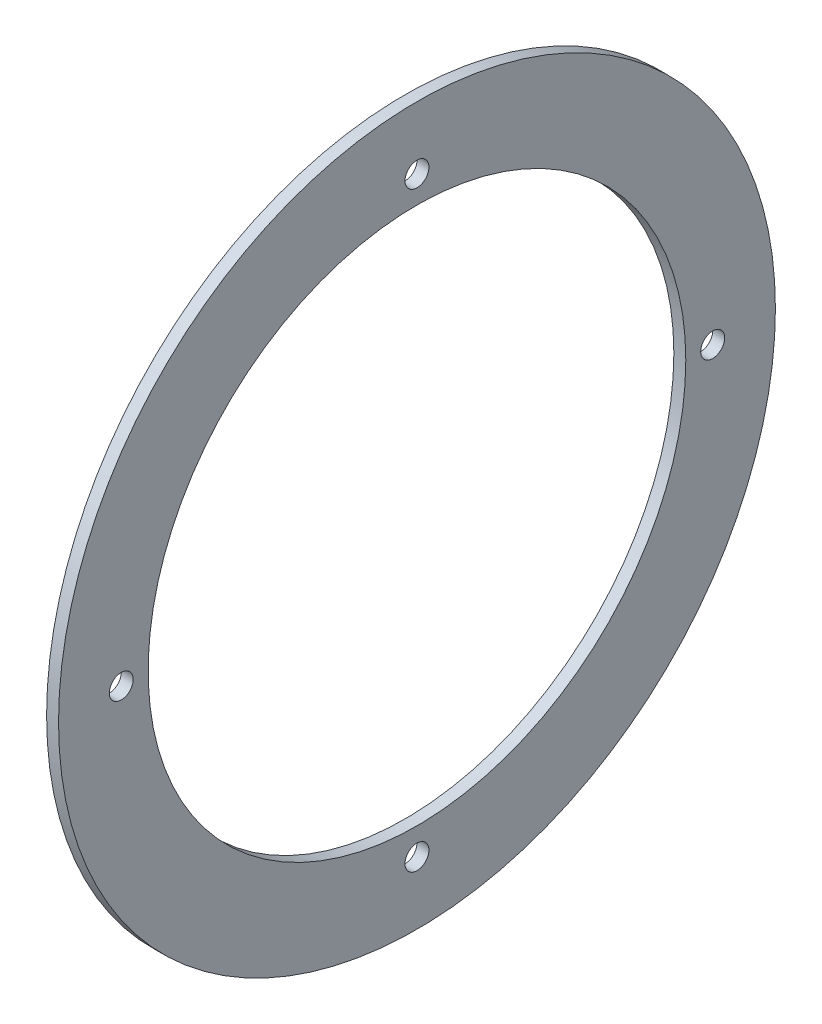
ISO-10303-21;
HEADER;
FILE_DESCRIPTION(('STEP AP214'),'2;1');
FILE_NAME('part.step','',(''),(''),'','','');
FILE_SCHEMA(('AUTOMOTIVE_DESIGN { 1 0 10303 214 1 1 1 1 }'));
ENDSEC;
DATA;
#1=APPLICATION_CONTEXT('core data for automotive mechanical design processes');
#2=APPLICATION_PROTOCOL_DEFINITION('international standard','automotive_design',2000,#1);
#3=PRODUCT_CONTEXT('',#1,'mechanical');
#4=PRODUCT('Part','Part','',(#3));
#5=PRODUCT_RELATED_PRODUCT_CATEGORY('part','',(#4));
#6=PRODUCT_DEFINITION_FORMATION('','',#4);
#7=PRODUCT_DEFINITION_CONTEXT('part definition',#1,'design');
#8=PRODUCT_DEFINITION('design','',#6,#7);
#9=PRODUCT_DEFINITION_SHAPE('','',#8);
#10=(LENGTH_UNIT() NAMED_UNIT(*) SI_UNIT(.MILLI.,.METRE.));
#11=(NAMED_UNIT(*) PLANE_ANGLE_UNIT() SI_UNIT($,.RADIAN.));
#12=(NAMED_UNIT(*) SI_UNIT($,.STERADIAN.) SOLID_ANGLE_UNIT());
#13=UNCERTAINTY_MEASURE_WITH_UNIT(LENGTH_MEASURE(1.E-05),#10,'distance_accuracy_value','');
#14=(GEOMETRIC_REPRESENTATION_CONTEXT(3) GLOBAL_UNCERTAINTY_ASSIGNED_CONTEXT((#13)) GLOBAL_UNIT_ASSIGNED_CONTEXT((#10,
#11,#12)) REPRESENTATION_CONTEXT('',''));
#15=CARTESIAN_POINT('',(0.,0.,0.));
#16=DIRECTION('',(0.,0.,1.));
#17=DIRECTION('',(1.,0.,0.));
#18=AXIS2_PLACEMENT_3D('',#15,#16,#17);
#19=CARTESIAN_POINT('',(2.,0.,0.));
#20=DIRECTION('',(1.,0.,0.));
#21=DIRECTION('',(0.,0.,-1.));
#22=AXIS2_PLACEMENT_3D('',#19,#20,#21);
#23=PLANE('',#22);
#24=CARTESIAN_POINT('',(2.,-49.4974746830583,0.));
#25=DIRECTION('',(1.,0.,0.));
#26=DIRECTION('',(0.,0.,-1.));
#27=AXIS2_PLACEMENT_3D('',#24,#25,#26);
#28=CIRCLE('',#27,2.);
#29=CARTESIAN_POINT('',(2.,-49.4974746830583,-2.));
#30=VERTEX_POINT('',#29);
#31=EDGE_CURVE('E60',#30,#30,#28,.T.);
#32=ORIENTED_EDGE('',*,*,#31,.F.);
#33=EDGE_LOOP('',(#32));
#34=FACE_BOUND('',#33,.T.);
#35=CARTESIAN_POINT('',(2.,49.4974746830583,0.));
#36=DIRECTION('',(1.,0.,0.));
#37=DIRECTION('',(0.,0.,-1.));
#38=AXIS2_PLACEMENT_3D('',#35,#36,#37);
#39=CIRCLE('',#38,2.);
#40=CARTESIAN_POINT('',(2.,49.4974746830583,-2.));
#41=VERTEX_POINT('',#40);
#42=EDGE_CURVE('E48',#41,#41,#39,.T.);
#43=ORIENTED_EDGE('',*,*,#42,.F.);
#44=EDGE_LOOP('',(#43));
#45=FACE_BOUND('',#44,.T.);
#46=CARTESIAN_POINT('',(2.,0.,0.));
#47=DIRECTION('',(1.,0.,0.));
#48=DIRECTION('',(0.,0.,-1.));
#49=AXIS2_PLACEMENT_3D('',#46,#47,#48);
#50=CIRCLE('',#49,60.);
#51=CARTESIAN_POINT('',(2.,0.,-60.));
#52=VERTEX_POINT('',#51);
#53=EDGE_CURVE('E10',#52,#52,#50,.T.);
#54=ORIENTED_EDGE('',*,*,#53,.T.);
#55=EDGE_LOOP('',(#54));
#56=FACE_BOUND('',#55,.T.);
#57=CARTESIAN_POINT('',(2.,0.,0.));
#58=DIRECTION('',(1.,0.,0.));
#59=DIRECTION('',(0.,0.,-1.));
#60=AXIS2_PLACEMENT_3D('',#57,#58,#59);
#61=CIRCLE('',#60,45.);
#62=CARTESIAN_POINT('',(2.,0.,-45.));
#63=VERTEX_POINT('',#62);
#64=EDGE_CURVE('E43',#63,#63,#61,.T.);
#65=ORIENTED_EDGE('',*,*,#64,.F.);
#66=EDGE_LOOP('',(#65));
#67=FACE_BOUND('',#66,.T.);
#68=CARTESIAN_POINT('',(2.,0.,49.4974746830583));
#69=DIRECTION('',(1.,0.,0.));
#70=DIRECTION('',(0.,0.,-1.));
#71=AXIS2_PLACEMENT_3D('',#68,#69,#70);
#72=CIRCLE('',#71,2.);
#73=CARTESIAN_POINT('',(2.,0.,47.4974746830583));
#74=VERTEX_POINT('',#73);
#75=EDGE_CURVE('E54',#74,#74,#72,.T.);
#76=ORIENTED_EDGE('',*,*,#75,.F.);
#77=EDGE_LOOP('',(#76));
#78=FACE_BOUND('',#77,.T.);
#79=CARTESIAN_POINT('',(2.,0.,-49.4974746830583));
#80=DIRECTION('',(1.,0.,0.));
#81=DIRECTION('',(0.,0.,-1.));
#82=AXIS2_PLACEMENT_3D('',#79,#80,#81);
#83=CIRCLE('',#82,2.);
#84=CARTESIAN_POINT('',(2.,0.,-51.4974746830583));
#85=VERTEX_POINT('',#84);
#86=EDGE_CURVE('E66',#85,#85,#83,.T.);
#87=ORIENTED_EDGE('',*,*,#86,.F.);
#88=EDGE_LOOP('',(#87));
#89=FACE_BOUND('',#88,.T.);
#90=ADVANCED_FACE('F32',(#34,#45,#56,#67,#78,#89),#23,.T.);
#91=CARTESIAN_POINT('',(0.,0.,0.));
#92=DIRECTION('',(1.,0.,0.));
#93=DIRECTION('',(0.,0.,-1.));
#94=AXIS2_PLACEMENT_3D('',#91,#92,#93);
#95=PLANE('',#94);
#96=CARTESIAN_POINT('',(0.,0.,0.));
#97=DIRECTION('',(1.,0.,0.));
#98=DIRECTION('',(0.,0.,-1.));
#99=AXIS2_PLACEMENT_3D('',#96,#97,#98);
#100=CIRCLE('',#99,60.);
#101=CARTESIAN_POINT('',(0.,0.,-60.));
#102=VERTEX_POINT('',#101);
#103=EDGE_CURVE('E36',#102,#102,#100,.T.);
#104=ORIENTED_EDGE('',*,*,#103,.F.);
#105=EDGE_LOOP('',(#104));
#106=FACE_BOUND('',#105,.T.);
#107=CARTESIAN_POINT('',(0.,0.,0.));
#108=DIRECTION('',(1.,0.,0.));
#109=DIRECTION('',(0.,0.,-1.));
#110=AXIS2_PLACEMENT_3D('',#107,#108,#109);
#111=CIRCLE('',#110,45.);
#112=CARTESIAN_POINT('',(0.,0.,-45.));
#113=VERTEX_POINT('',#112);
#114=EDGE_CURVE('E45',#113,#113,#111,.T.);
#115=ORIENTED_EDGE('',*,*,#114,.T.);
#116=EDGE_LOOP('',(#115));
#117=FACE_BOUND('',#116,.T.);
#118=CARTESIAN_POINT('',(0.,49.4974746830583,0.));
#119=DIRECTION('',(1.,0.,0.));
#120=DIRECTION('',(0.,0.,-1.));
#121=AXIS2_PLACEMENT_3D('',#118,#119,#120);
#122=CIRCLE('',#121,2.);
#123=CARTESIAN_POINT('',(0.,49.4974746830583,-2.));
#124=VERTEX_POINT('',#123);
#125=EDGE_CURVE('E51',#124,#124,#122,.T.);
#126=ORIENTED_EDGE('',*,*,#125,.T.);
#127=EDGE_LOOP('',(#126));
#128=FACE_BOUND('',#127,.T.);
#129=CARTESIAN_POINT('',(0.,0.,49.4974746830583));
#130=DIRECTION('',(1.,0.,0.));
#131=DIRECTION('',(0.,0.,-1.));
#132=AXIS2_PLACEMENT_3D('',#129,#130,#131);
#133=CIRCLE('',#132,2.);
#134=CARTESIAN_POINT('',(0.,0.,47.4974746830583));
#135=VERTEX_POINT('',#134);
#136=EDGE_CURVE('E57',#135,#135,#133,.T.);
#137=ORIENTED_EDGE('',*,*,#136,.T.);
#138=EDGE_LOOP('',(#137));
#139=FACE_BOUND('',#138,.T.);
#140=CARTESIAN_POINT('',(0.,-49.4974746830583,0.));
#141=DIRECTION('',(1.,0.,0.));
#142=DIRECTION('',(0.,0.,-1.));
#143=AXIS2_PLACEMENT_3D('',#140,#141,#142);
#144=CIRCLE('',#143,2.);
#145=CARTESIAN_POINT('',(0.,-49.4974746830583,-2.));
#146=VERTEX_POINT('',#145);
#147=EDGE_CURVE('E63',#146,#146,#144,.T.);
#148=ORIENTED_EDGE('',*,*,#147,.T.);
#149=EDGE_LOOP('',(#148));
#150=FACE_BOUND('',#149,.T.);
#151=CARTESIAN_POINT('',(0.,0.,-49.4974746830583));
#152=DIRECTION('',(1.,0.,0.));
#153=DIRECTION('',(0.,0.,-1.));
#154=AXIS2_PLACEMENT_3D('',#151,#152,#153);
#155=CIRCLE('',#154,2.);
#156=CARTESIAN_POINT('',(0.,0.,-51.4974746830583));
#157=VERTEX_POINT('',#156);
#158=EDGE_CURVE('E69',#157,#157,#155,.T.);
#159=ORIENTED_EDGE('',*,*,#158,.T.);
#160=EDGE_LOOP('',(#159));
#161=FACE_BOUND('',#160,.T.);
#162=ADVANCED_FACE('F79',(#106,#117,#128,#139,#150,#161),#95,.F.);
#163=CARTESIAN_POINT('',(2.,0.,0.));
#164=DIRECTION('',(-1.,0.,0.));
#165=DIRECTION('',(0.,0.,1.));
#166=AXIS2_PLACEMENT_3D('',#163,#164,#165);
#167=CYLINDRICAL_SURFACE('',#166,60.);
#168=ORIENTED_EDGE('',*,*,#53,.F.);
#169=EDGE_LOOP('',(#168));
#170=FACE_BOUND('',#169,.T.);
#171=ORIENTED_EDGE('',*,*,#103,.T.);
#172=EDGE_LOOP('',(#171));
#173=FACE_BOUND('',#172,.T.);
#174=ADVANCED_FACE('F34',(#170,#173),#167,.T.);
#175=CARTESIAN_POINT('',(2.,0.,0.));
#176=DIRECTION('',(-1.,0.,0.));
#177=DIRECTION('',(0.,0.,1.));
#178=AXIS2_PLACEMENT_3D('',#175,#176,#177);
#179=CYLINDRICAL_SURFACE('',#178,45.);
#180=ORIENTED_EDGE('',*,*,#64,.T.);
#181=EDGE_LOOP('',(#180));
#182=FACE_BOUND('',#181,.T.);
#183=ORIENTED_EDGE('',*,*,#114,.F.);
#184=EDGE_LOOP('',(#183));
#185=FACE_BOUND('',#184,.T.);
#186=ADVANCED_FACE('F89',(#182,#185),#179,.F.);
#187=CARTESIAN_POINT('',(2.,49.4974746830583,0.));
#188=DIRECTION('',(-1.,0.,0.));
#189=DIRECTION('',(0.,0.,1.));
#190=AXIS2_PLACEMENT_3D('',#187,#188,#189);
#191=CYLINDRICAL_SURFACE('',#190,2.);
#192=ORIENTED_EDGE('',*,*,#42,.T.);
#193=EDGE_LOOP('',(#192));
#194=FACE_BOUND('',#193,.T.);
#195=ORIENTED_EDGE('',*,*,#125,.F.);
#196=EDGE_LOOP('',(#195));
#197=FACE_BOUND('',#196,.T.);
#198=ADVANCED_FACE('F92',(#194,#197),#191,.F.);
#199=CARTESIAN_POINT('',(2.,0.,49.4974746830583));
#200=DIRECTION('',(-1.,0.,0.));
#201=DIRECTION('',(0.,0.,1.));
#202=AXIS2_PLACEMENT_3D('',#199,#200,#201);
#203=CYLINDRICAL_SURFACE('',#202,2.);
#204=ORIENTED_EDGE('',*,*,#75,.T.);
#205=EDGE_LOOP('',(#204));
#206=FACE_BOUND('',#205,.T.);
#207=ORIENTED_EDGE('',*,*,#136,.F.);
#208=EDGE_LOOP('',(#207));
#209=FACE_BOUND('',#208,.T.);
#210=ADVANCED_FACE('F96',(#206,#209),#203,.F.);
#211=CARTESIAN_POINT('',(2.,-49.4974746830583,0.));
#212=DIRECTION('',(-1.,0.,0.));
#213=DIRECTION('',(0.,0.,1.));
#214=AXIS2_PLACEMENT_3D('',#211,#212,#213);
#215=CYLINDRICAL_SURFACE('',#214,2.);
#216=ORIENTED_EDGE('',*,*,#31,.T.);
#217=EDGE_LOOP('',(#216));
#218=FACE_BOUND('',#217,.T.);
#219=ORIENTED_EDGE('',*,*,#147,.F.);
#220=EDGE_LOOP('',(#219));
#221=FACE_BOUND('',#220,.T.);
#222=ADVANCED_FACE('F100',(#218,#221),#215,.F.);
#223=CARTESIAN_POINT('',(2.,0.,-49.4974746830583));
#224=DIRECTION('',(-1.,0.,0.));
#225=DIRECTION('',(0.,0.,1.));
#226=AXIS2_PLACEMENT_3D('',#223,#224,#225);
#227=CYLINDRICAL_SURFACE('',#226,2.);
#228=ORIENTED_EDGE('',*,*,#86,.T.);
#229=EDGE_LOOP('',(#228));
#230=FACE_BOUND('',#229,.T.);
#231=ORIENTED_EDGE('',*,*,#158,.F.);
#232=EDGE_LOOP('',(#231));
#233=FACE_BOUND('',#232,.T.);
#234=ADVANCED_FACE('F75',(#230,#233),#227,.F.);
#235=CLOSED_SHELL('',(#90,#162,#174,#186,#198,#210,#222,#234));
#236=MANIFOLD_SOLID_BREP('B2',#235);
#237=ADVANCED_BREP_SHAPE_REPRESENTATION('',(#18,#236),#14);
#238=SHAPE_DEFINITION_REPRESENTATION(#9,#237);
ENDSEC;
END-ISO-10303-21;
